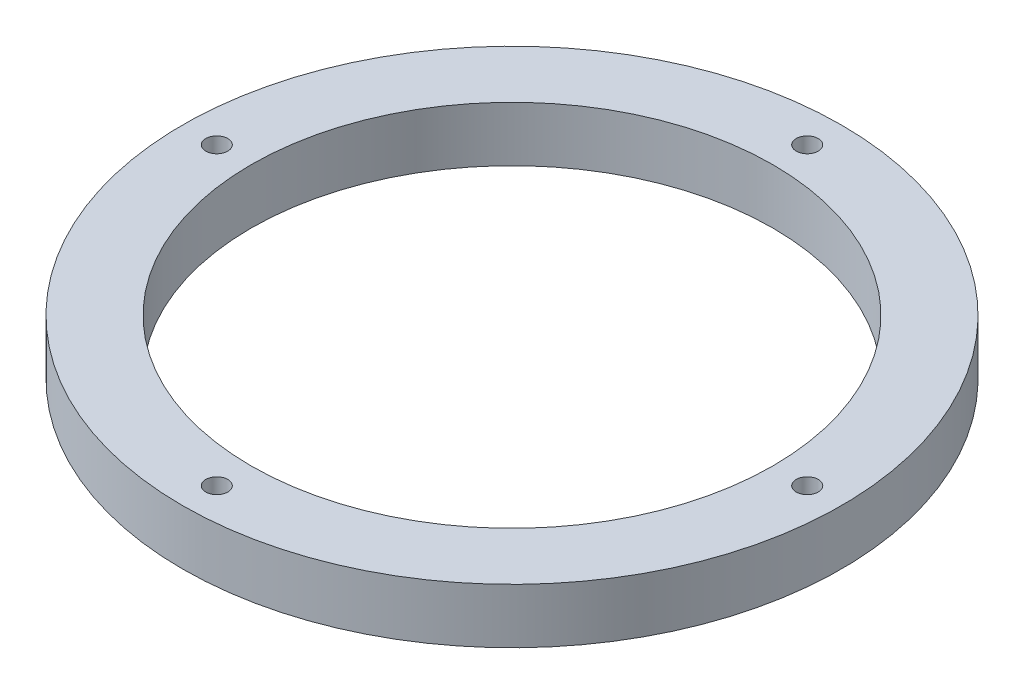
ISO-10303-21;
HEADER;
FILE_DESCRIPTION(('STEP AP214'),'2;1');
FILE_NAME('part.step','',(''),(''),'','','');
FILE_SCHEMA(('AUTOMOTIVE_DESIGN { 1 0 10303 214 1 1 1 1 }'));
ENDSEC;
DATA;
#1=APPLICATION_CONTEXT('core data for automotive mechanical design processes');
#2=APPLICATION_PROTOCOL_DEFINITION('international standard','automotive_design',2000,#1);
#3=PRODUCT_CONTEXT('',#1,'mechanical');
#4=PRODUCT('Part','Part','',(#3));
#5=PRODUCT_RELATED_PRODUCT_CATEGORY('part','',(#4));
#6=PRODUCT_DEFINITION_FORMATION('','',#4);
#7=PRODUCT_DEFINITION_CONTEXT('part definition',#1,'design');
#8=PRODUCT_DEFINITION('design','',#6,#7);
#9=PRODUCT_DEFINITION_SHAPE('','',#8);
#10=(LENGTH_UNIT() NAMED_UNIT(*) SI_UNIT(.MILLI.,.METRE.));
#11=(NAMED_UNIT(*) PLANE_ANGLE_UNIT() SI_UNIT($,.RADIAN.));
#12=(NAMED_UNIT(*) SI_UNIT($,.STERADIAN.) SOLID_ANGLE_UNIT());
#13=UNCERTAINTY_MEASURE_WITH_UNIT(LENGTH_MEASURE(1.E-05),#10,'distance_accuracy_value','');
#14=(GEOMETRIC_REPRESENTATION_CONTEXT(3) GLOBAL_UNCERTAINTY_ASSIGNED_CONTEXT((#13)) GLOBAL_UNIT_ASSIGNED_CONTEXT((#10,
#11,#12)) REPRESENTATION_CONTEXT('',''));
#15=CARTESIAN_POINT('',(0.,0.,0.));
#16=DIRECTION('',(0.,0.,1.));
#17=DIRECTION('',(1.,0.,0.));
#18=AXIS2_PLACEMENT_3D('',#15,#16,#17);
#19=CARTESIAN_POINT('',(0.,10.,0.));
#20=DIRECTION('',(0.,-1.,0.));
#21=DIRECTION('',(0.,0.,-1.));
#22=AXIS2_PLACEMENT_3D('',#19,#20,#21);
#23=CYLINDRICAL_SURFACE('',#22,60.);
#24=CARTESIAN_POINT('',(0.,10.,0.));
#25=DIRECTION('',(0.,1.,0.));
#26=DIRECTION('',(0.,0.,1.));
#27=AXIS2_PLACEMENT_3D('',#24,#25,#26);
#28=CIRCLE('',#27,60.);
#29=CARTESIAN_POINT('',(0.,10.,60.));
#30=VERTEX_POINT('',#29);
#31=EDGE_CURVE('E10',#30,#30,#28,.T.);
#32=ORIENTED_EDGE('',*,*,#31,.F.);
#33=EDGE_LOOP('',(#32));
#34=FACE_BOUND('',#33,.T.);
#35=CARTESIAN_POINT('',(0.,0.,0.));
#36=DIRECTION('',(0.,1.,0.));
#37=DIRECTION('',(0.,0.,1.));
#38=AXIS2_PLACEMENT_3D('',#35,#36,#37);
#39=CIRCLE('',#38,60.);
#40=CARTESIAN_POINT('',(0.,0.,60.));
#41=VERTEX_POINT('',#40);
#42=EDGE_CURVE('E39',#41,#41,#39,.T.);
#43=ORIENTED_EDGE('',*,*,#42,.T.);
#44=EDGE_LOOP('',(#43));
#45=FACE_BOUND('',#44,.T.);
#46=ADVANCED_FACE('F36',(#34,#45),#23,.T.);
#47=CARTESIAN_POINT('',(0.,10.,0.));
#48=DIRECTION('',(0.,1.,0.));
#49=DIRECTION('',(0.,0.,1.));
#50=AXIS2_PLACEMENT_3D('',#47,#48,#49);
#51=PLANE('',#50);
#52=CARTESIAN_POINT('',(-53.75,10.,1.87667121962818E-13));
#53=DIRECTION('',(0.,1.,0.));
#54=DIRECTION('',(1.,0.,0.));
#55=AXIS2_PLACEMENT_3D('',#52,#53,#54);
#56=CIRCLE('',#55,2.);
#57=CARTESIAN_POINT('',(-51.75,10.,1.80684159285132E-13));
#58=VERTEX_POINT('',#57);
#59=EDGE_CURVE('E79',#58,#58,#56,.T.);
#60=ORIENTED_EDGE('',*,*,#59,.F.);
#61=EDGE_LOOP('',(#60));
#62=FACE_BOUND('',#61,.T.);
#63=CARTESIAN_POINT('',(0.,10.,53.75));
#64=DIRECTION('',(0.,1.,0.));
#65=DIRECTION('',(0.,0.,-1.));
#66=AXIS2_PLACEMENT_3D('',#63,#64,#65);
#67=CIRCLE('',#66,2.);
#68=CARTESIAN_POINT('',(0.,10.,51.75));
#69=VERTEX_POINT('',#68);
#70=EDGE_CURVE('E70',#69,#69,#67,.T.);
#71=ORIENTED_EDGE('',*,*,#70,.F.);
#72=EDGE_LOOP('',(#71));
#73=FACE_BOUND('',#72,.T.);
#74=CARTESIAN_POINT('',(53.75,10.,-5.63001365888455E-13));
#75=DIRECTION('',(0.,1.,0.));
#76=DIRECTION('',(-1.,0.,0.));
#77=AXIS2_PLACEMENT_3D('',#74,#75,#76);
#78=CIRCLE('',#77,2.);
#79=CARTESIAN_POINT('',(51.75,10.,-5.42052477855396E-13));
#80=VERTEX_POINT('',#79);
#81=EDGE_CURVE('E71',#80,#80,#78,.T.);
#82=ORIENTED_EDGE('',*,*,#81,.F.);
#83=EDGE_LOOP('',(#82));
#84=FACE_BOUND('',#83,.T.);
#85=CARTESIAN_POINT('',(0.,10.,-53.75));
#86=DIRECTION('',(0.,1.,0.));
#87=DIRECTION('',(0.,0.,1.));
#88=AXIS2_PLACEMENT_3D('',#85,#86,#87);
#89=CIRCLE('',#88,2.);
#90=CARTESIAN_POINT('',(0.,10.,-51.75));
#91=VERTEX_POINT('',#90);
#92=EDGE_CURVE('E61',#91,#91,#89,.T.);
#93=ORIENTED_EDGE('',*,*,#92,.F.);
#94=EDGE_LOOP('',(#93));
#95=FACE_BOUND('',#94,.T.);
#96=CARTESIAN_POINT('',(0.,10.,0.));
#97=DIRECTION('',(0.,1.,0.));
#98=DIRECTION('',(0.,0.,1.));
#99=AXIS2_PLACEMENT_3D('',#96,#97,#98);
#100=CIRCLE('',#99,47.5);
#101=CARTESIAN_POINT('',(0.,10.,47.5));
#102=VERTEX_POINT('',#101);
#103=EDGE_CURVE('E53',#102,#102,#100,.T.);
#104=ORIENTED_EDGE('',*,*,#103,.F.);
#105=EDGE_LOOP('',(#104));
#106=FACE_BOUND('',#105,.T.);
#107=ORIENTED_EDGE('',*,*,#31,.T.);
#108=EDGE_LOOP('',(#107));
#109=FACE_BOUND('',#108,.T.);
#110=ADVANCED_FACE('F92',(#62,#73,#84,#95,#106,#109),#51,.T.);
#111=CARTESIAN_POINT('',(0.,0.,0.));
#112=DIRECTION('',(0.,1.,0.));
#113=DIRECTION('',(0.,0.,1.));
#114=AXIS2_PLACEMENT_3D('',#111,#112,#113);
#115=PLANE('',#114);
#116=CARTESIAN_POINT('',(-53.75,0.,1.87667121962818E-13));
#117=DIRECTION('',(0.,1.,0.));
#118=DIRECTION('',(0.,0.,1.));
#119=AXIS2_PLACEMENT_3D('',#116,#117,#118);
#120=CIRCLE('',#119,2.);
#121=CARTESIAN_POINT('',(-53.75,0.,2.00000000000019));
#122=VERTEX_POINT('',#121);
#123=EDGE_CURVE('E65',#122,#122,#120,.F.);
#124=ORIENTED_EDGE('',*,*,#123,.F.);
#125=EDGE_LOOP('',(#124));
#126=FACE_BOUND('',#125,.T.);
#127=CARTESIAN_POINT('',(0.,0.,53.75));
#128=DIRECTION('',(0.,1.,0.));
#129=DIRECTION('',(0.,0.,1.));
#130=AXIS2_PLACEMENT_3D('',#127,#128,#129);
#131=CIRCLE('',#130,2.);
#132=CARTESIAN_POINT('',(0.,0.,55.75));
#133=VERTEX_POINT('',#132);
#134=EDGE_CURVE('E75',#133,#133,#131,.F.);
#135=ORIENTED_EDGE('',*,*,#134,.F.);
#136=EDGE_LOOP('',(#135));
#137=FACE_BOUND('',#136,.T.);
#138=CARTESIAN_POINT('',(53.75,0.,-5.63001365888455E-13));
#139=DIRECTION('',(0.,1.,0.));
#140=DIRECTION('',(0.,0.,1.));
#141=AXIS2_PLACEMENT_3D('',#138,#139,#140);
#142=CIRCLE('',#141,2.);
#143=CARTESIAN_POINT('',(53.75,0.,1.99999999999944));
#144=VERTEX_POINT('',#143);
#145=EDGE_CURVE('E66',#144,#144,#142,.F.);
#146=ORIENTED_EDGE('',*,*,#145,.F.);
#147=EDGE_LOOP('',(#146));
#148=FACE_BOUND('',#147,.T.);
#149=CARTESIAN_POINT('',(0.,0.,-53.75));
#150=DIRECTION('',(0.,1.,0.));
#151=DIRECTION('',(0.,0.,1.));
#152=AXIS2_PLACEMENT_3D('',#149,#150,#151);
#153=CIRCLE('',#152,2.);
#154=CARTESIAN_POINT('',(0.,0.,-51.75));
#155=VERTEX_POINT('',#154);
#156=EDGE_CURVE('E57',#155,#155,#153,.F.);
#157=ORIENTED_EDGE('',*,*,#156,.F.);
#158=EDGE_LOOP('',(#157));
#159=FACE_BOUND('',#158,.T.);
#160=CARTESIAN_POINT('',(0.,0.,0.));
#161=DIRECTION('',(0.,1.,0.));
#162=DIRECTION('',(0.,0.,1.));
#163=AXIS2_PLACEMENT_3D('',#160,#161,#162);
#164=CIRCLE('',#163,47.5);
#165=CARTESIAN_POINT('',(0.,0.,47.5));
#166=VERTEX_POINT('',#165);
#167=EDGE_CURVE('E48',#166,#166,#164,.F.);
#168=ORIENTED_EDGE('',*,*,#167,.F.);
#169=EDGE_LOOP('',(#168));
#170=FACE_BOUND('',#169,.T.);
#171=ORIENTED_EDGE('',*,*,#42,.F.);
#172=EDGE_LOOP('',(#171));
#173=FACE_BOUND('',#172,.T.);
#174=ADVANCED_FACE('F95',(#126,#137,#148,#159,#170,#173),#115,.F.);
#175=CARTESIAN_POINT('',(0.,-134.350288425444,0.));
#176=DIRECTION('',(0.,1.,0.));
#177=DIRECTION('',(0.,0.,1.));
#178=AXIS2_PLACEMENT_3D('',#175,#176,#177);
#179=CYLINDRICAL_SURFACE('',#178,47.5);
#180=ORIENTED_EDGE('',*,*,#167,.T.);
#181=EDGE_LOOP('',(#180));
#182=FACE_BOUND('',#181,.T.);
#183=ORIENTED_EDGE('',*,*,#103,.T.);
#184=EDGE_LOOP('',(#183));
#185=FACE_BOUND('',#184,.T.);
#186=ADVANCED_FACE('F105',(#182,#185),#179,.F.);
#187=CARTESIAN_POINT('',(0.,-5.65685424949238,-53.75));
#188=DIRECTION('',(0.,1.,0.));
#189=DIRECTION('',(0.,0.,1.));
#190=AXIS2_PLACEMENT_3D('',#187,#188,#189);
#191=CYLINDRICAL_SURFACE('',#190,2.);
#192=ORIENTED_EDGE('',*,*,#156,.T.);
#193=EDGE_LOOP('',(#192));
#194=FACE_BOUND('',#193,.T.);
#195=ORIENTED_EDGE('',*,*,#92,.T.);
#196=EDGE_LOOP('',(#195));
#197=FACE_BOUND('',#196,.T.);
#198=ADVANCED_FACE('F107',(#194,#197),#191,.F.);
#199=CARTESIAN_POINT('',(53.75,-5.65685424949238,-5.63001365888455E-13));
#200=DIRECTION('',(0.,1.,0.));
#201=DIRECTION('',(0.,0.,1.));
#202=AXIS2_PLACEMENT_3D('',#199,#200,#201);
#203=CYLINDRICAL_SURFACE('',#202,2.);
#204=ORIENTED_EDGE('',*,*,#145,.T.);
#205=EDGE_LOOP('',(#204));
#206=FACE_BOUND('',#205,.T.);
#207=ORIENTED_EDGE('',*,*,#81,.T.);
#208=EDGE_LOOP('',(#207));
#209=FACE_BOUND('',#208,.T.);
#210=ADVANCED_FACE('F114',(#206,#209),#203,.F.);
#211=CARTESIAN_POINT('',(0.,-5.65685424949238,53.75));
#212=DIRECTION('',(0.,1.,0.));
#213=DIRECTION('',(0.,0.,1.));
#214=AXIS2_PLACEMENT_3D('',#211,#212,#213);
#215=CYLINDRICAL_SURFACE('',#214,2.);
#216=ORIENTED_EDGE('',*,*,#134,.T.);
#217=EDGE_LOOP('',(#216));
#218=FACE_BOUND('',#217,.T.);
#219=ORIENTED_EDGE('',*,*,#70,.T.);
#220=EDGE_LOOP('',(#219));
#221=FACE_BOUND('',#220,.T.);
#222=ADVANCED_FACE('F144',(#218,#221),#215,.F.);
#223=CARTESIAN_POINT('',(-53.75,-5.65685424949238,1.87667121962818E-13));
#224=DIRECTION('',(0.,1.,0.));
#225=DIRECTION('',(0.,0.,1.));
#226=AXIS2_PLACEMENT_3D('',#223,#224,#225);
#227=CYLINDRICAL_SURFACE('',#226,2.);
#228=ORIENTED_EDGE('',*,*,#123,.T.);
#229=EDGE_LOOP('',(#228));
#230=FACE_BOUND('',#229,.T.);
#231=ORIENTED_EDGE('',*,*,#59,.T.);
#232=EDGE_LOOP('',(#231));
#233=FACE_BOUND('',#232,.T.);
#234=ADVANCED_FACE('F90',(#230,#233),#227,.F.);
#235=CLOSED_SHELL('',(#46,#110,#174,#186,#198,#210,#222,#234));
#236=MANIFOLD_SOLID_BREP('B2',#235);
#237=ADVANCED_BREP_SHAPE_REPRESENTATION('',(#18,#236),#14);
#238=SHAPE_DEFINITION_REPRESENTATION(#9,#237);
ENDSEC;
END-ISO-10303-21;
